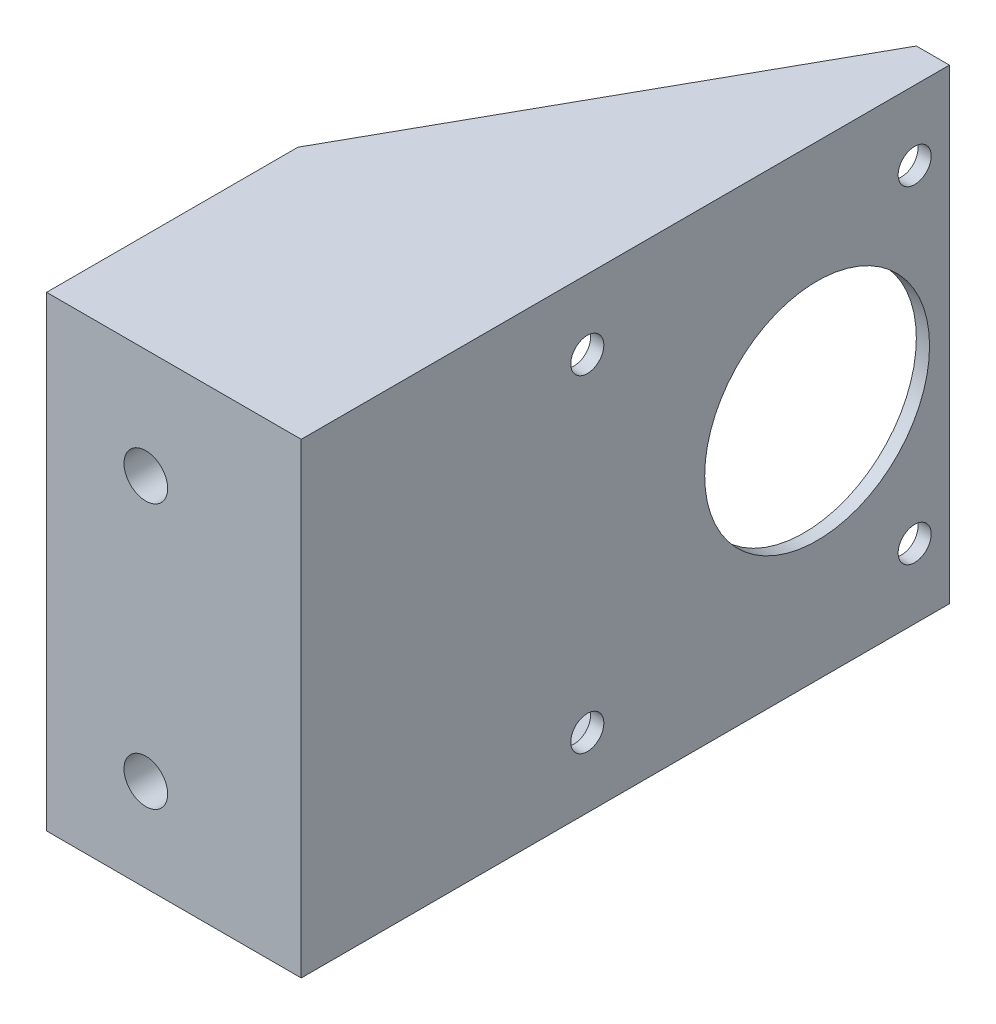
ISO-10303-21;
HEADER;
FILE_DESCRIPTION(('STEP AP214'),'2;1');
FILE_NAME('part.step','',(''),(''),'','','');
FILE_SCHEMA(('AUTOMOTIVE_DESIGN { 1 0 10303 214 1 1 1 1 }'));
ENDSEC;
DATA;
#1=APPLICATION_CONTEXT('core data for automotive mechanical design processes');
#2=APPLICATION_PROTOCOL_DEFINITION('international standard','automotive_design',2000,#1);
#3=PRODUCT_CONTEXT('',#1,'mechanical');
#4=PRODUCT('Part','Part','',(#3));
#5=PRODUCT_RELATED_PRODUCT_CATEGORY('part','',(#4));
#6=PRODUCT_DEFINITION_FORMATION('','',#4);
#7=PRODUCT_DEFINITION_CONTEXT('part definition',#1,'design');
#8=PRODUCT_DEFINITION('design','',#6,#7);
#9=PRODUCT_DEFINITION_SHAPE('','',#8);
#10=(LENGTH_UNIT() NAMED_UNIT(*) SI_UNIT(.MILLI.,.METRE.));
#11=(NAMED_UNIT(*) PLANE_ANGLE_UNIT() SI_UNIT($,.RADIAN.));
#12=(NAMED_UNIT(*) SI_UNIT($,.STERADIAN.) SOLID_ANGLE_UNIT());
#13=UNCERTAINTY_MEASURE_WITH_UNIT(LENGTH_MEASURE(1.E-05),#10,'distance_accuracy_value','');
#14=(GEOMETRIC_REPRESENTATION_CONTEXT(3) GLOBAL_UNCERTAINTY_ASSIGNED_CONTEXT((#13)) GLOBAL_UNIT_ASSIGNED_CONTEXT((#10,
#11,#12)) REPRESENTATION_CONTEXT('',''));
#15=CARTESIAN_POINT('',(0.,0.,0.));
#16=DIRECTION('',(0.,0.,1.));
#17=DIRECTION('',(1.,0.,0.));
#18=AXIS2_PLACEMENT_3D('',#15,#16,#17);
#19=CARTESIAN_POINT('',(145.991839145614,30.2680497080806,464.500831462039));
#20=DIRECTION('',(0.,0.,-1.));
#21=DIRECTION('',(1.,0.,0.));
#22=AXIS2_PLACEMENT_3D('',#19,#20,#21);
#23=PLANE('',#22);
#24=CARTESIAN_POINT('',(160.99183914562,-21.2680497080842,464.500831462039));
#25=DIRECTION('',(0.,0.,-1.));
#26=DIRECTION('',(0.,1.,0.));
#27=AXIS2_PLACEMENT_3D('',#24,#25,#26);
#28=CIRCLE('',#27,6.3);
#29=CARTESIAN_POINT('',(160.99183914562,-14.9680497080842,464.500831462039));
#30=VERTEX_POINT('',#29);
#31=EDGE_CURVE('E233',#30,#30,#28,.T.);
#32=ORIENTED_EDGE('',*,*,#31,.F.);
#33=EDGE_LOOP('',(#32));
#34=FACE_BOUND('',#33,.T.);
#35=CARTESIAN_POINT('',(160.99183914562,18.7319502919158,464.500831462039));
#36=DIRECTION('',(0.,0.,-1.));
#37=DIRECTION('',(0.,1.,0.));
#38=AXIS2_PLACEMENT_3D('',#35,#36,#37);
#39=CIRCLE('',#38,6.3);
#40=CARTESIAN_POINT('',(160.99183914562,25.0319502919158,464.500831462039));
#41=VERTEX_POINT('',#40);
#42=EDGE_CURVE('E236',#41,#41,#39,.T.);
#43=ORIENTED_EDGE('',*,*,#42,.F.);
#44=EDGE_LOOP('',(#43));
#45=FACE_BOUND('',#44,.T.);
#46=DIRECTION('',(-1.,0.,0.));
#47=VECTOR('',#46,1.);
#48=CARTESIAN_POINT('',(145.991839145619,31.2680497080806,464.500831462039));
#49=LINE('',#48,#47);
#50=CARTESIAN_POINT('',(182.491839145616,31.2680497080809,464.50083146204));
#51=VERTEX_POINT('',#50);
#52=CARTESIAN_POINT('',(145.991839145619,31.2680497080806,464.50083146204));
#53=VERTEX_POINT('',#52);
#54=EDGE_CURVE('E125',#51,#53,#49,.T.);
#55=ORIENTED_EDGE('',*,*,#54,.F.);
#56=DIRECTION('',(0.,-1.,0.));
#57=VECTOR('',#56,1.);
#58=CARTESIAN_POINT('',(182.491839145616,-1.93503361991714E-13,464.500831462039));
#59=LINE('',#58,#57);
#60=CARTESIAN_POINT('',(182.491839145617,-31.2680497080795,464.500831462039));
#61=VERTEX_POINT('',#60);
#62=EDGE_CURVE('E114',#51,#61,#59,.T.);
#63=ORIENTED_EDGE('',*,*,#62,.T.);
#64=DIRECTION('',(1.,0.,0.));
#65=VECTOR('',#64,1.);
#66=CARTESIAN_POINT('',(145.99183914562,-31.2680497080798,464.50083146204));
#67=LINE('',#66,#65);
#68=CARTESIAN_POINT('',(145.991839145619,-31.2680497080797,464.500831462039));
#69=VERTEX_POINT('',#68);
#70=EDGE_CURVE('E67',#69,#61,#67,.T.);
#71=ORIENTED_EDGE('',*,*,#70,.F.);
#72=DIRECTION('',(0.,1.,0.));
#73=VECTOR('',#72,1.);
#74=CARTESIAN_POINT('',(145.991839145619,-35.26804970808,464.500831462039));
#75=LINE('',#74,#73);
#76=EDGE_CURVE('E51',#69,#53,#75,.T.);
#77=ORIENTED_EDGE('',*,*,#76,.T.);
#78=EDGE_LOOP('',(#55,#63,#71,#77));
#79=FACE_BOUND('',#78,.T.);
#80=ADVANCED_FACE('F43',(#34,#45,#79),#23,.T.);
#81=CARTESIAN_POINT('',(179.991839145614,31.2680497080809,404.500831462039));
#82=DIRECTION('',(0.,1.,0.));
#83=DIRECTION('',(0.,0.,-1.));
#84=AXIS2_PLACEMENT_3D('',#81,#82,#83);
#85=PLANE('',#84);
#86=DIRECTION('',(0.,0.,1.));
#87=VECTOR('',#86,1.);
#88=CARTESIAN_POINT('',(182.491839145619,31.2680497080816,8.65120238914589E-13));
#89=LINE('',#88,#87);
#90=CARTESIAN_POINT('',(182.491839145617,31.2680497080809,404.500831462039));
#91=VERTEX_POINT('',#90);
#92=EDGE_CURVE('E118',#91,#51,#89,.T.);
#93=ORIENTED_EDGE('',*,*,#92,.T.);
#94=ORIENTED_EDGE('',*,*,#54,.T.);
#95=DIRECTION('',(0.487495172515776,0.,-0.87312568211788));
#96=VECTOR('',#95,1.);
#97=CARTESIAN_POINT('',(179.491839145616,31.2680497080809,404.50083146204));
#98=LINE('',#97,#96);
#99=CARTESIAN_POINT('',(179.491839145616,31.2680497080809,404.50083146204));
#100=VERTEX_POINT('',#99);
#101=EDGE_CURVE('E131',#53,#100,#98,.T.);
#102=ORIENTED_EDGE('',*,*,#101,.T.);
#103=DIRECTION('',(1.,0.,0.));
#104=VECTOR('',#103,1.);
#105=CARTESIAN_POINT('',(184.491839145616,31.2680497080809,404.50083146204));
#106=LINE('',#105,#104);
#107=EDGE_CURVE('E127',#100,#91,#106,.T.);
#108=ORIENTED_EDGE('',*,*,#107,.T.);
#109=EDGE_LOOP('',(#93,#94,#102,#108));
#110=FACE_BOUND('',#109,.T.);
#111=ADVANCED_FACE('F124',(#110),#85,.F.);
#112=CARTESIAN_POINT('',(145.991839145617,-31.2680497080798,464.500831462039));
#113=DIRECTION('',(0.,1.,0.));
#114=DIRECTION('',(-1.,0.,0.));
#115=AXIS2_PLACEMENT_3D('',#112,#113,#114);
#116=PLANE('',#115);
#117=ORIENTED_EDGE('',*,*,#70,.T.);
#118=DIRECTION('',(0.,0.,-1.));
#119=VECTOR('',#118,1.);
#120=CARTESIAN_POINT('',(182.491839145619,-31.2680497080788,7.70657985721372E-13));
#121=LINE('',#120,#119);
#122=CARTESIAN_POINT('',(182.491839145617,-31.2680497080795,404.50083146204));
#123=VERTEX_POINT('',#122);
#124=EDGE_CURVE('E119',#61,#123,#121,.T.);
#125=ORIENTED_EDGE('',*,*,#124,.T.);
#126=DIRECTION('',(-1.,0.,0.));
#127=VECTOR('',#126,1.);
#128=CARTESIAN_POINT('',(145.99183914562,-31.2680497080797,404.50083146204));
#129=LINE('',#128,#127);
#130=CARTESIAN_POINT('',(179.491839145617,-31.2680497080795,404.50083146204));
#131=VERTEX_POINT('',#130);
#132=EDGE_CURVE('E191',#123,#131,#129,.T.);
#133=ORIENTED_EDGE('',*,*,#132,.T.);
#134=DIRECTION('',(-0.487495172515776,0.,0.87312568211788));
#135=VECTOR('',#134,1.);
#136=CARTESIAN_POINT('',(180.196269372935,-31.2680497080795,403.239165383261));
#137=LINE('',#136,#135);
#138=EDGE_CURVE('E196',#131,#69,#137,.T.);
#139=ORIENTED_EDGE('',*,*,#138,.T.);
#140=EDGE_LOOP('',(#117,#125,#133,#139));
#141=FACE_BOUND('',#140,.T.);
#142=ADVANCED_FACE('F202',(#141),#116,.T.);
#143=CARTESIAN_POINT('',(145.99183914562,-35.2680497080799,384.141691839679));
#144=DIRECTION('',(1.,0.,0.));
#145=DIRECTION('',(0.,0.,-1.));
#146=AXIS2_PLACEMENT_3D('',#143,#144,#145);
#147=PLANE('',#146);
#148=CARTESIAN_POINT('',(145.991839145619,-35.2680497080791,464.500831462039));
#149=VERTEX_POINT('',#148);
#150=EDGE_CURVE('E12',#149,#69,#75,.T.);
#151=ORIENTED_EDGE('',*,*,#150,.F.);
#152=DIRECTION('',(0.,0.,1.));
#153=VECTOR('',#152,1.);
#154=CARTESIAN_POINT('',(145.99183914562,-35.2680497080799,384.141691839679));
#155=LINE('',#154,#153);
#156=CARTESIAN_POINT('',(145.991839145619,-35.2680497080787,502.500831462038));
#157=VERTEX_POINT('',#156);
#158=EDGE_CURVE('E46',#149,#157,#155,.T.);
#159=ORIENTED_EDGE('',*,*,#158,.T.);
#160=DIRECTION('',(0.,1.,0.));
#161=VECTOR('',#160,1.);
#162=CARTESIAN_POINT('',(145.991839145619,-35.2680497080787,502.500831462038));
#163=LINE('',#162,#161);
#164=CARTESIAN_POINT('',(145.991839145619,35.2680497080805,502.500831462037));
#165=VERTEX_POINT('',#164);
#166=EDGE_CURVE('E163',#157,#165,#163,.T.);
#167=ORIENTED_EDGE('',*,*,#166,.T.);
#168=DIRECTION('',(0.,0.,1.));
#169=VECTOR('',#168,1.);
#170=CARTESIAN_POINT('',(145.99183914562,35.2680497080794,384.141691839678));
#171=LINE('',#170,#169);
#172=CARTESIAN_POINT('',(145.991839145619,35.2680497080802,464.500831462039));
#173=VERTEX_POINT('',#172);
#174=EDGE_CURVE('E162',#173,#165,#171,.T.);
#175=ORIENTED_EDGE('',*,*,#174,.F.);
#176=DIRECTION('',(0.,1.,0.));
#177=VECTOR('',#176,1.);
#178=CARTESIAN_POINT('',(145.991839145619,-41.0218513999984,464.50083146204));
#179=LINE('',#178,#177);
#180=EDGE_CURVE('E134',#53,#173,#179,.T.);
#181=ORIENTED_EDGE('',*,*,#180,.F.);
#182=ORIENTED_EDGE('',*,*,#76,.F.);
#183=EDGE_LOOP('',(#151,#159,#167,#175,#181,#182));
#184=FACE_BOUND('',#183,.T.);
#185=ADVANCED_FACE('F185',(#184),#147,.F.);
#186=CARTESIAN_POINT('',(145.99183914562,35.2680497080794,384.141691839678));
#187=DIRECTION('',(0.,-1.,0.));
#188=DIRECTION('',(0.,0.,-1.));
#189=AXIS2_PLACEMENT_3D('',#186,#187,#188);
#190=PLANE('',#189);
#191=DIRECTION('',(0.,0.,1.));
#192=VECTOR('',#191,1.);
#193=CARTESIAN_POINT('',(184.491839145617,35.2680497080794,384.141691839678));
#194=LINE('',#193,#192);
#195=CARTESIAN_POINT('',(184.491839145616,35.2680497080796,404.50083146204));
#196=VERTEX_POINT('',#195);
#197=CARTESIAN_POINT('',(184.491839145616,35.2680497080805,502.500831462037));
#198=VERTEX_POINT('',#197);
#199=EDGE_CURVE('E158',#196,#198,#194,.T.);
#200=ORIENTED_EDGE('',*,*,#199,.F.);
#201=DIRECTION('',(-1.,0.,0.));
#202=VECTOR('',#201,1.);
#203=CARTESIAN_POINT('',(184.491839145616,35.2680497080796,404.50083146204));
#204=LINE('',#203,#202);
#205=CARTESIAN_POINT('',(179.491839145616,35.2680497080796,404.50083146204));
#206=VERTEX_POINT('',#205);
#207=EDGE_CURVE('E138',#196,#206,#204,.T.);
#208=ORIENTED_EDGE('',*,*,#207,.T.);
#209=DIRECTION('',(-0.487495172515776,0.,0.87312568211788));
#210=VECTOR('',#209,1.);
#211=CARTESIAN_POINT('',(179.491839145616,35.2680497080796,404.50083146204));
#212=LINE('',#211,#210);
#213=EDGE_CURVE('E141',#206,#173,#212,.T.);
#214=ORIENTED_EDGE('',*,*,#213,.T.);
#215=ORIENTED_EDGE('',*,*,#174,.T.);
#216=DIRECTION('',(1.,0.,0.));
#217=VECTOR('',#216,1.);
#218=CARTESIAN_POINT('',(145.991839145619,35.2680497080805,502.500831462037));
#219=LINE('',#218,#217);
#220=EDGE_CURVE('E159',#165,#198,#219,.T.);
#221=ORIENTED_EDGE('',*,*,#220,.T.);
#222=EDGE_LOOP('',(#200,#208,#214,#215,#221));
#223=FACE_BOUND('',#222,.T.);
#224=ADVANCED_FACE('F284',(#223),#190,.F.);
#225=CARTESIAN_POINT('',(184.491839145617,-35.2680497080799,384.141691839679));
#226=DIRECTION('',(-1.,0.,0.));
#227=DIRECTION('',(0.,0.,1.));
#228=AXIS2_PLACEMENT_3D('',#225,#226,#227);
#229=PLANE('',#228);
#230=DIRECTION('',(0.,0.,1.));
#231=VECTOR('',#230,1.);
#232=CARTESIAN_POINT('',(184.491839145617,-35.2680497080799,384.141691839679));
#233=LINE('',#232,#231);
#234=CARTESIAN_POINT('',(184.491839145616,-35.2680497080797,404.50083146204));
#235=VERTEX_POINT('',#234);
#236=CARTESIAN_POINT('',(184.491839145616,-35.2680497080787,502.500831462038));
#237=VERTEX_POINT('',#236);
#238=EDGE_CURVE('E154',#235,#237,#233,.T.);
#239=ORIENTED_EDGE('',*,*,#238,.F.);
#240=DIRECTION('',(0.,1.,0.));
#241=VECTOR('',#240,1.);
#242=CARTESIAN_POINT('',(184.491839145616,-41.021851399999,404.50083146204));
#243=LINE('',#242,#241);
#244=EDGE_CURVE('E144',#235,#196,#243,.T.);
#245=ORIENTED_EDGE('',*,*,#244,.T.);
#246=ORIENTED_EDGE('',*,*,#199,.T.);
#247=DIRECTION('',(0.,-1.,0.));
#248=VECTOR('',#247,1.);
#249=CARTESIAN_POINT('',(184.491839145616,-35.2680497080787,502.500831462038));
#250=LINE('',#249,#248);
#251=EDGE_CURVE('E155',#198,#237,#250,.T.);
#252=ORIENTED_EDGE('',*,*,#251,.T.);
#253=EDGE_LOOP('',(#239,#245,#246,#252));
#254=FACE_BOUND('',#253,.T.);
#255=CARTESIAN_POINT('',(184.491839145617,1.70349091108642E-13,424.50083146204));
#256=DIRECTION('',(1.,0.,0.));
#257=DIRECTION('',(0.,0.,-1.));
#258=AXIS2_PLACEMENT_3D('',#255,#256,#257);
#259=CIRCLE('',#258,17.);
#260=CARTESIAN_POINT('',(184.491839145617,1.70349091108642E-13,407.50083146204));
#261=VERTEX_POINT('',#260);
#262=EDGE_CURVE('E250',#261,#261,#259,.T.);
#263=ORIENTED_EDGE('',*,*,#262,.F.);
#264=EDGE_LOOP('',(#263));
#265=FACE_BOUND('',#264,.T.);
#266=CARTESIAN_POINT('',(184.491839145616,-24.7499999999999,459.25083146204));
#267=DIRECTION('',(1.,0.,0.));
#268=DIRECTION('',(0.,0.,-1.));
#269=AXIS2_PLACEMENT_3D('',#266,#267,#268);
#270=CIRCLE('',#269,2.5);
#271=CARTESIAN_POINT('',(184.491839145616,-24.7499999999999,456.75083146204));
#272=VERTEX_POINT('',#271);
#273=EDGE_CURVE('E270',#272,#272,#270,.T.);
#274=ORIENTED_EDGE('',*,*,#273,.F.);
#275=EDGE_LOOP('',(#274));
#276=FACE_BOUND('',#275,.T.);
#277=CARTESIAN_POINT('',(184.491839145616,24.7500000000001,459.25083146204));
#278=DIRECTION('',(1.,0.,0.));
#279=DIRECTION('',(0.,0.,-1.));
#280=AXIS2_PLACEMENT_3D('',#277,#278,#279);
#281=CIRCLE('',#280,2.5);
#282=CARTESIAN_POINT('',(184.491839145616,24.7500000000001,456.75083146204));
#283=VERTEX_POINT('',#282);
#284=EDGE_CURVE('E273',#283,#283,#281,.T.);
#285=ORIENTED_EDGE('',*,*,#284,.F.);
#286=EDGE_LOOP('',(#285));
#287=FACE_BOUND('',#286,.T.);
#288=CARTESIAN_POINT('',(184.491839145617,24.7500000000002,409.75083146204));
#289=DIRECTION('',(1.,0.,0.));
#290=DIRECTION('',(0.,0.,-1.));
#291=AXIS2_PLACEMENT_3D('',#288,#289,#290);
#292=CIRCLE('',#291,2.5);
#293=CARTESIAN_POINT('',(184.491839145617,24.7500000000002,407.25083146204));
#294=VERTEX_POINT('',#293);
#295=EDGE_CURVE('E276',#294,#294,#292,.T.);
#296=ORIENTED_EDGE('',*,*,#295,.F.);
#297=EDGE_LOOP('',(#296));
#298=FACE_BOUND('',#297,.T.);
#299=CARTESIAN_POINT('',(184.491839145617,-24.7499999999998,409.75083146204));
#300=DIRECTION('',(1.,0.,0.));
#301=DIRECTION('',(0.,0.,-1.));
#302=AXIS2_PLACEMENT_3D('',#299,#300,#301);
#303=CIRCLE('',#302,2.5);
#304=CARTESIAN_POINT('',(184.491839145617,-24.7499999999998,407.25083146204));
#305=VERTEX_POINT('',#304);
#306=EDGE_CURVE('E128',#305,#305,#303,.T.);
#307=ORIENTED_EDGE('',*,*,#306,.F.);
#308=EDGE_LOOP('',(#307));
#309=FACE_BOUND('',#308,.T.);
#310=ADVANCED_FACE('F178',(#254,#265,#276,#287,#298,#309),#229,.F.);
#311=CARTESIAN_POINT('',(145.99183914562,-35.2680497080799,384.141691839679));
#312=DIRECTION('',(0.,1.,0.));
#313=DIRECTION('',(0.,0.,1.));
#314=AXIS2_PLACEMENT_3D('',#311,#312,#313);
#315=PLANE('',#314);
#316=ORIENTED_EDGE('',*,*,#158,.F.);
#317=DIRECTION('',(-0.487495172515776,0.,0.87312568211788));
#318=VECTOR('',#317,1.);
#319=CARTESIAN_POINT('',(180.196269372934,-35.2680497080797,403.239165383261));
#320=LINE('',#319,#318);
#321=CARTESIAN_POINT('',(179.491839145617,-35.2680497080797,404.50083146204));
#322=VERTEX_POINT('',#321);
#323=EDGE_CURVE('E187',#322,#149,#320,.T.);
#324=ORIENTED_EDGE('',*,*,#323,.F.);
#325=DIRECTION('',(-1.,0.,0.));
#326=VECTOR('',#325,1.);
#327=CARTESIAN_POINT('',(145.99183914562,-35.2680497080797,404.50083146204));
#328=LINE('',#327,#326);
#329=EDGE_CURVE('E175',#235,#322,#328,.T.);
#330=ORIENTED_EDGE('',*,*,#329,.F.);
#331=ORIENTED_EDGE('',*,*,#238,.T.);
#332=DIRECTION('',(-1.,0.,0.));
#333=VECTOR('',#332,1.);
#334=CARTESIAN_POINT('',(145.991839145619,-35.2680497080787,502.500831462038));
#335=LINE('',#334,#333);
#336=EDGE_CURVE('E151',#237,#157,#335,.T.);
#337=ORIENTED_EDGE('',*,*,#336,.T.);
#338=EDGE_LOOP('',(#316,#324,#330,#331,#337));
#339=FACE_BOUND('',#338,.T.);
#340=ADVANCED_FACE('F170',(#339),#315,.F.);
#341=CARTESIAN_POINT('',(-1.44905972203242E-12,4.74555296592965E-12,502.500831462037));
#342=DIRECTION('',(0.,0.,-1.));
#343=DIRECTION('',(0.,1.,0.));
#344=AXIS2_PLACEMENT_3D('',#341,#342,#343);
#345=PLANE('',#344);
#346=CARTESIAN_POINT('',(160.99183914562,-21.2680497080843,502.500831462038));
#347=DIRECTION('',(0.,0.,-1.));
#348=DIRECTION('',(0.,1.,0.));
#349=AXIS2_PLACEMENT_3D('',#346,#347,#348);
#350=CIRCLE('',#349,3.29999999999997);
#351=CARTESIAN_POINT('',(160.99183914562,-17.9680497080843,502.500831462038));
#352=VERTEX_POINT('',#351);
#353=EDGE_CURVE('E239',#352,#352,#350,.T.);
#354=ORIENTED_EDGE('',*,*,#353,.T.);
#355=EDGE_LOOP('',(#354));
#356=FACE_BOUND('',#355,.T.);
#357=CARTESIAN_POINT('',(160.99183914562,18.7319502919157,502.500831462038));
#358=DIRECTION('',(0.,0.,-1.));
#359=DIRECTION('',(0.,1.,0.));
#360=AXIS2_PLACEMENT_3D('',#357,#358,#359);
#361=CIRCLE('',#360,3.29999999999997);
#362=CARTESIAN_POINT('',(160.99183914562,22.0319502919157,502.500831462038));
#363=VERTEX_POINT('',#362);
#364=EDGE_CURVE('E242',#363,#363,#361,.T.);
#365=ORIENTED_EDGE('',*,*,#364,.T.);
#366=EDGE_LOOP('',(#365));
#367=FACE_BOUND('',#366,.T.);
#368=ORIENTED_EDGE('',*,*,#166,.F.);
#369=ORIENTED_EDGE('',*,*,#336,.F.);
#370=ORIENTED_EDGE('',*,*,#251,.F.);
#371=ORIENTED_EDGE('',*,*,#220,.F.);
#372=EDGE_LOOP('',(#368,#369,#370,#371));
#373=FACE_BOUND('',#372,.T.);
#374=ADVANCED_FACE('F182',(#356,#367,#373),#345,.F.);
#375=CARTESIAN_POINT('',(179.491839145616,-41.021851399999,404.50083146204));
#376=DIRECTION('',(-0.87312568211788,0.,-0.487495172515776));
#377=DIRECTION('',(-0.487495172515776,0.,0.87312568211788));
#378=AXIS2_PLACEMENT_3D('',#375,#376,#377);
#379=PLANE('',#378);
#380=ORIENTED_EDGE('',*,*,#101,.F.);
#381=ORIENTED_EDGE('',*,*,#180,.T.);
#382=ORIENTED_EDGE('',*,*,#213,.F.);
#383=DIRECTION('',(0.,1.,0.));
#384=VECTOR('',#383,1.);
#385=CARTESIAN_POINT('',(179.491839145616,-41.021851399999,404.50083146204));
#386=LINE('',#385,#384);
#387=EDGE_CURVE('E147',#100,#206,#386,.T.);
#388=ORIENTED_EDGE('',*,*,#387,.F.);
#389=EDGE_LOOP('',(#380,#381,#382,#388));
#390=FACE_BOUND('',#389,.T.);
#391=ADVANCED_FACE('F219',(#390),#379,.T.);
#392=CARTESIAN_POINT('',(184.491839145616,-41.021851399999,404.50083146204));
#393=DIRECTION('',(0.,0.,-1.));
#394=DIRECTION('',(0.,1.,0.));
#395=AXIS2_PLACEMENT_3D('',#392,#393,#394);
#396=PLANE('',#395);
#397=ORIENTED_EDGE('',*,*,#107,.F.);
#398=ORIENTED_EDGE('',*,*,#387,.T.);
#399=ORIENTED_EDGE('',*,*,#207,.F.);
#400=ORIENTED_EDGE('',*,*,#244,.F.);
#401=ORIENTED_EDGE('',*,*,#329,.T.);
#402=DIRECTION('',(0.,-1.,0.));
#403=VECTOR('',#402,1.);
#404=CARTESIAN_POINT('',(179.491839145617,41.0218513999996,404.50083146204));
#405=LINE('',#404,#403);
#406=EDGE_CURVE('E189',#131,#322,#405,.T.);
#407=ORIENTED_EDGE('',*,*,#406,.F.);
#408=ORIENTED_EDGE('',*,*,#132,.F.);
#409=DIRECTION('',(0.,1.,0.));
#410=VECTOR('',#409,1.);
#411=CARTESIAN_POINT('',(182.491839145617,5.3596354881061E-13,404.50083146204));
#412=LINE('',#411,#410);
#413=EDGE_CURVE('E59',#123,#91,#412,.T.);
#414=ORIENTED_EDGE('',*,*,#413,.T.);
#415=EDGE_LOOP('',(#397,#398,#399,#400,#401,#407,#408,#414));
#416=FACE_BOUND('',#415,.T.);
#417=ADVANCED_FACE('F205',(#416),#396,.T.);
#418=CARTESIAN_POINT('',(180.196269372934,41.0218513999996,403.239165383261));
#419=DIRECTION('',(0.87312568211788,0.,0.487495172515776));
#420=DIRECTION('',(0.487495172515776,0.,-0.87312568211788));
#421=AXIS2_PLACEMENT_3D('',#418,#419,#420);
#422=PLANE('',#421);
#423=ORIENTED_EDGE('',*,*,#138,.F.);
#424=ORIENTED_EDGE('',*,*,#406,.T.);
#425=ORIENTED_EDGE('',*,*,#323,.T.);
#426=ORIENTED_EDGE('',*,*,#150,.T.);
#427=EDGE_LOOP('',(#423,#424,#425,#426));
#428=FACE_BOUND('',#427,.T.);
#429=ADVANCED_FACE('F206',(#428),#422,.F.);
#430=CARTESIAN_POINT('',(95.8271766228332,-24.7499999999998,409.750831462039));
#431=DIRECTION('',(1.,0.,0.));
#432=DIRECTION('',(0.,0.,-1.));
#433=AXIS2_PLACEMENT_3D('',#430,#431,#432);
#434=CYLINDRICAL_SURFACE('',#433,2.5);
#435=CARTESIAN_POINT('',(182.491839145617,-24.7499999999998,409.75083146204));
#436=DIRECTION('',(1.,0.,0.));
#437=DIRECTION('',(0.,1.,0.));
#438=AXIS2_PLACEMENT_3D('',#435,#436,#437);
#439=CIRCLE('',#438,2.5);
#440=CARTESIAN_POINT('',(182.491839145617,-22.2499999999998,409.75083146204));
#441=VERTEX_POINT('',#440);
#442=EDGE_CURVE('E193',#441,#441,#439,.F.);
#443=ORIENTED_EDGE('',*,*,#442,.T.);
#444=EDGE_LOOP('',(#443));
#445=FACE_BOUND('',#444,.T.);
#446=ORIENTED_EDGE('',*,*,#306,.T.);
#447=EDGE_LOOP('',(#446));
#448=FACE_BOUND('',#447,.T.);
#449=ADVANCED_FACE('F208',(#445,#448),#434,.F.);
#450=CARTESIAN_POINT('',(95.8271766228332,24.7500000000002,409.75083146204));
#451=DIRECTION('',(1.,0.,0.));
#452=DIRECTION('',(0.,0.,-1.));
#453=AXIS2_PLACEMENT_3D('',#450,#451,#452);
#454=CYLINDRICAL_SURFACE('',#453,2.5);
#455=CARTESIAN_POINT('',(182.491839145617,24.7500000000002,409.75083146204));
#456=DIRECTION('',(1.,0.,0.));
#457=DIRECTION('',(0.,1.,0.));
#458=AXIS2_PLACEMENT_3D('',#455,#456,#457);
#459=CIRCLE('',#458,2.5);
#460=CARTESIAN_POINT('',(182.491839145617,27.2500000000002,409.75083146204));
#461=VERTEX_POINT('',#460);
#462=EDGE_CURVE('E254',#461,#461,#459,.F.);
#463=ORIENTED_EDGE('',*,*,#462,.T.);
#464=EDGE_LOOP('',(#463));
#465=FACE_BOUND('',#464,.T.);
#466=ORIENTED_EDGE('',*,*,#295,.T.);
#467=EDGE_LOOP('',(#466));
#468=FACE_BOUND('',#467,.T.);
#469=ADVANCED_FACE('F215',(#465,#468),#454,.F.);
#470=CARTESIAN_POINT('',(95.827176622833,24.7500000000001,459.25083146204));
#471=DIRECTION('',(1.,0.,0.));
#472=DIRECTION('',(0.,0.,-1.));
#473=AXIS2_PLACEMENT_3D('',#470,#471,#472);
#474=CYLINDRICAL_SURFACE('',#473,2.5);
#475=CARTESIAN_POINT('',(182.491839145616,24.7500000000001,459.25083146204));
#476=DIRECTION('',(1.,0.,0.));
#477=DIRECTION('',(0.,1.,0.));
#478=AXIS2_PLACEMENT_3D('',#475,#476,#477);
#479=CIRCLE('',#478,2.5);
#480=CARTESIAN_POINT('',(182.491839145616,27.2500000000001,459.25083146204));
#481=VERTEX_POINT('',#480);
#482=EDGE_CURVE('E258',#481,#481,#479,.F.);
#483=ORIENTED_EDGE('',*,*,#482,.T.);
#484=EDGE_LOOP('',(#483));
#485=FACE_BOUND('',#484,.T.);
#486=ORIENTED_EDGE('',*,*,#284,.T.);
#487=EDGE_LOOP('',(#486));
#488=FACE_BOUND('',#487,.T.);
#489=ADVANCED_FACE('F332',(#485,#488),#474,.F.);
#490=CARTESIAN_POINT('',(95.827176622833,-24.7499999999999,459.250831462039));
#491=DIRECTION('',(1.,0.,0.));
#492=DIRECTION('',(0.,0.,-1.));
#493=AXIS2_PLACEMENT_3D('',#490,#491,#492);
#494=CYLINDRICAL_SURFACE('',#493,2.5);
#495=CARTESIAN_POINT('',(182.491839145617,-24.7499999999999,459.25083146204));
#496=DIRECTION('',(1.,0.,0.));
#497=DIRECTION('',(0.,1.,0.));
#498=AXIS2_PLACEMENT_3D('',#495,#496,#497);
#499=CIRCLE('',#498,2.5);
#500=CARTESIAN_POINT('',(182.491839145617,-22.2499999999999,459.25083146204));
#501=VERTEX_POINT('',#500);
#502=EDGE_CURVE('E259',#501,#501,#499,.F.);
#503=ORIENTED_EDGE('',*,*,#502,.T.);
#504=EDGE_LOOP('',(#503));
#505=FACE_BOUND('',#504,.T.);
#506=ORIENTED_EDGE('',*,*,#273,.T.);
#507=EDGE_LOOP('',(#506));
#508=FACE_BOUND('',#507,.T.);
#509=ADVANCED_FACE('F336',(#505,#508),#494,.F.);
#510=CARTESIAN_POINT('',(95.8271766228332,1.70349091108639E-13,424.500831462039));
#511=DIRECTION('',(1.,0.,0.));
#512=DIRECTION('',(0.,0.,-1.));
#513=AXIS2_PLACEMENT_3D('',#510,#511,#512);
#514=CYLINDRICAL_SURFACE('',#513,17.);
#515=CARTESIAN_POINT('',(182.491839145617,1.70349091108642E-13,424.50083146204));
#516=DIRECTION('',(1.,0.,0.));
#517=DIRECTION('',(0.,1.,0.));
#518=AXIS2_PLACEMENT_3D('',#515,#516,#517);
#519=CIRCLE('',#518,17.);
#520=CARTESIAN_POINT('',(182.491839145617,17.0000000000002,424.50083146204));
#521=VERTEX_POINT('',#520);
#522=EDGE_CURVE('E255',#521,#521,#519,.F.);
#523=ORIENTED_EDGE('',*,*,#522,.T.);
#524=EDGE_LOOP('',(#523));
#525=FACE_BOUND('',#524,.T.);
#526=ORIENTED_EDGE('',*,*,#262,.T.);
#527=EDGE_LOOP('',(#526));
#528=FACE_BOUND('',#527,.T.);
#529=ADVANCED_FACE('F327',(#525,#528),#514,.F.);
#530=CARTESIAN_POINT('',(182.491839145617,1.36091758962331E-13,434.50083146204));
#531=DIRECTION('',(1.,0.,0.));
#532=DIRECTION('',(0.,1.,0.));
#533=AXIS2_PLACEMENT_3D('',#530,#531,#532);
#534=PLANE('',#533);
#535=ORIENTED_EDGE('',*,*,#462,.F.);
#536=EDGE_LOOP('',(#535));
#537=FACE_BOUND('',#536,.T.);
#538=ORIENTED_EDGE('',*,*,#502,.F.);
#539=EDGE_LOOP('',(#538));
#540=FACE_BOUND('',#539,.T.);
#541=ORIENTED_EDGE('',*,*,#124,.F.);
#542=ORIENTED_EDGE('',*,*,#62,.F.);
#543=ORIENTED_EDGE('',*,*,#92,.F.);
#544=ORIENTED_EDGE('',*,*,#413,.F.);
#545=EDGE_LOOP('',(#541,#542,#543,#544));
#546=FACE_BOUND('',#545,.T.);
#547=ORIENTED_EDGE('',*,*,#522,.F.);
#548=EDGE_LOOP('',(#547));
#549=FACE_BOUND('',#548,.T.);
#550=ORIENTED_EDGE('',*,*,#482,.F.);
#551=EDGE_LOOP('',(#550));
#552=FACE_BOUND('',#551,.T.);
#553=ORIENTED_EDGE('',*,*,#442,.F.);
#554=EDGE_LOOP('',(#553));
#555=FACE_BOUND('',#554,.T.);
#556=ADVANCED_FACE('F116',(#537,#540,#546,#549,#552,#555),#534,.F.);
#557=CARTESIAN_POINT('',(160.99183914562,18.7319502919158,464.500831462039));
#558=DIRECTION('',(0.,0.,-1.));
#559=DIRECTION('',(0.,1.,0.));
#560=AXIS2_PLACEMENT_3D('',#557,#558,#559);
#561=CYLINDRICAL_SURFACE('',#560,3.29999999999998);
#562=ORIENTED_EDGE('',*,*,#364,.F.);
#563=EDGE_LOOP('',(#562));
#564=FACE_BOUND('',#563,.T.);
#565=CARTESIAN_POINT('',(160.99183914562,18.7319502919158,467.500831462039));
#566=DIRECTION('',(0.,0.,-1.));
#567=DIRECTION('',(0.,1.,0.));
#568=AXIS2_PLACEMENT_3D('',#565,#566,#567);
#569=CIRCLE('',#568,3.3);
#570=CARTESIAN_POINT('',(160.99183914562,22.0319502919158,467.500831462039));
#571=VERTEX_POINT('',#570);
#572=EDGE_CURVE('E238',#571,#571,#569,.T.);
#573=ORIENTED_EDGE('',*,*,#572,.T.);
#574=EDGE_LOOP('',(#573));
#575=FACE_BOUND('',#574,.T.);
#576=ADVANCED_FACE('F310',(#564,#575),#561,.F.);
#577=CARTESIAN_POINT('',(160.99183914562,18.7319502919158,464.500831462039));
#578=DIRECTION('',(0.,0.,-1.));
#579=DIRECTION('',(0.,1.,0.));
#580=AXIS2_PLACEMENT_3D('',#577,#578,#579);
#581=CONICAL_SURFACE('',#580,6.3,0.785398163397448);
#582=ORIENTED_EDGE('',*,*,#572,.F.);
#583=EDGE_LOOP('',(#582));
#584=FACE_BOUND('',#583,.T.);
#585=ORIENTED_EDGE('',*,*,#42,.T.);
#586=EDGE_LOOP('',(#585));
#587=FACE_BOUND('',#586,.T.);
#588=ADVANCED_FACE('F312',(#584,#587),#581,.F.);
#589=CARTESIAN_POINT('',(160.99183914562,-21.2680497080842,464.500831462039));
#590=DIRECTION('',(0.,0.,-1.));
#591=DIRECTION('',(0.,1.,0.));
#592=AXIS2_PLACEMENT_3D('',#589,#590,#591);
#593=CYLINDRICAL_SURFACE('',#592,3.29999999999998);
#594=ORIENTED_EDGE('',*,*,#353,.F.);
#595=EDGE_LOOP('',(#594));
#596=FACE_BOUND('',#595,.T.);
#597=CARTESIAN_POINT('',(160.99183914562,-21.2680497080842,467.500831462039));
#598=DIRECTION('',(0.,0.,-1.));
#599=DIRECTION('',(0.,1.,0.));
#600=AXIS2_PLACEMENT_3D('',#597,#598,#599);
#601=CIRCLE('',#600,3.3);
#602=CARTESIAN_POINT('',(160.99183914562,-17.9680497080842,467.500831462039));
#603=VERTEX_POINT('',#602);
#604=EDGE_CURVE('E245',#603,#603,#601,.T.);
#605=ORIENTED_EDGE('',*,*,#604,.T.);
#606=EDGE_LOOP('',(#605));
#607=FACE_BOUND('',#606,.T.);
#608=ADVANCED_FACE('F317',(#596,#607),#593,.F.);
#609=CARTESIAN_POINT('',(160.99183914562,-21.2680497080842,464.500831462039));
#610=DIRECTION('',(0.,0.,-1.));
#611=DIRECTION('',(0.,1.,0.));
#612=AXIS2_PLACEMENT_3D('',#609,#610,#611);
#613=CONICAL_SURFACE('',#612,6.3,0.785398163397448);
#614=ORIENTED_EDGE('',*,*,#604,.F.);
#615=EDGE_LOOP('',(#614));
#616=FACE_BOUND('',#615,.T.);
#617=ORIENTED_EDGE('',*,*,#31,.T.);
#618=EDGE_LOOP('',(#617));
#619=FACE_BOUND('',#618,.T.);
#620=ADVANCED_FACE('F322',(#616,#619),#613,.F.);
#621=CLOSED_SHELL('',(#80,#111,#142,#185,#224,#310,#340,#374,#391,#417,#429,#449,#469,#489,#509,
#529,#556,#576,#588,#608,#620));
#622=MANIFOLD_SOLID_BREP('B2',#621);
#623=ADVANCED_BREP_SHAPE_REPRESENTATION('',(#18,#622),#14);
#624=SHAPE_DEFINITION_REPRESENTATION(#9,#623);
ENDSEC;
END-ISO-10303-21;
